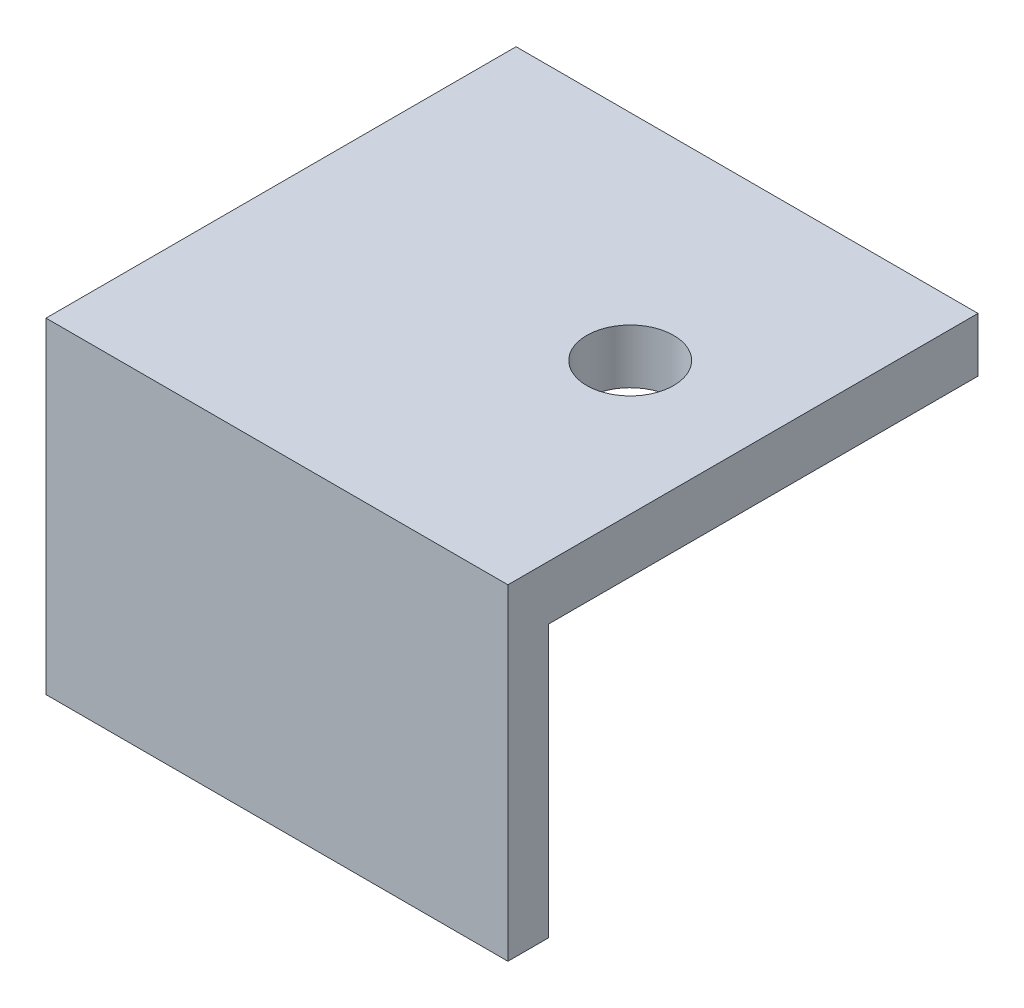
ISO-10303-21;
HEADER;
FILE_DESCRIPTION(('STEP AP214'),'2;1');
FILE_NAME('part.step','',(''),(''),'','','');
FILE_SCHEMA(('AUTOMOTIVE_DESIGN { 1 0 10303 214 1 1 1 1 }'));
ENDSEC;
DATA;
#1=APPLICATION_CONTEXT('core data for automotive mechanical design processes');
#2=APPLICATION_PROTOCOL_DEFINITION('international standard','automotive_design',2000,#1);
#3=PRODUCT_CONTEXT('',#1,'mechanical');
#4=PRODUCT('Part','Part','',(#3));
#5=PRODUCT_RELATED_PRODUCT_CATEGORY('part','',(#4));
#6=PRODUCT_DEFINITION_FORMATION('','',#4);
#7=PRODUCT_DEFINITION_CONTEXT('part definition',#1,'design');
#8=PRODUCT_DEFINITION('design','',#6,#7);
#9=PRODUCT_DEFINITION_SHAPE('','',#8);
#10=(LENGTH_UNIT() NAMED_UNIT(*) SI_UNIT(.MILLI.,.METRE.));
#11=(NAMED_UNIT(*) PLANE_ANGLE_UNIT() SI_UNIT($,.RADIAN.));
#12=(NAMED_UNIT(*) SI_UNIT($,.STERADIAN.) SOLID_ANGLE_UNIT());
#13=UNCERTAINTY_MEASURE_WITH_UNIT(LENGTH_MEASURE(1.E-05),#10,'distance_accuracy_value','');
#14=(GEOMETRIC_REPRESENTATION_CONTEXT(3) GLOBAL_UNCERTAINTY_ASSIGNED_CONTEXT((#13)) GLOBAL_UNIT_ASSIGNED_CONTEXT((#10,
#11,#12)) REPRESENTATION_CONTEXT('',''));
#15=CARTESIAN_POINT('',(0.,0.,0.));
#16=DIRECTION('',(0.,0.,1.));
#17=DIRECTION('',(1.,0.,0.));
#18=AXIS2_PLACEMENT_3D('',#15,#16,#17);
#19=CARTESIAN_POINT('',(0.,10.,0.));
#20=DIRECTION('',(1.,0.,0.));
#21=DIRECTION('',(0.,0.,-1.));
#22=AXIS2_PLACEMENT_3D('',#19,#20,#21);
#23=PLANE('',#22);
#24=DIRECTION('',(0.,0.,1.));
#25=VECTOR('',#24,1.);
#26=CARTESIAN_POINT('',(0.,12.,0.));
#27=LINE('',#26,#25);
#28=CARTESIAN_POINT('',(0.,12.,-17.3));
#29=VERTEX_POINT('',#28);
#30=CARTESIAN_POINT('',(0.,12.,0.));
#31=VERTEX_POINT('',#30);
#32=EDGE_CURVE('E123',#29,#31,#27,.T.);
#33=ORIENTED_EDGE('',*,*,#32,.F.);
#34=DIRECTION('',(0.,-1.,0.));
#35=VECTOR('',#34,1.);
#36=CARTESIAN_POINT('',(0.,12.,-17.3));
#37=LINE('',#36,#35);
#38=CARTESIAN_POINT('',(0.,0.,-17.3));
#39=VERTEX_POINT('',#38);
#40=EDGE_CURVE('E133',#29,#39,#37,.T.);
#41=ORIENTED_EDGE('',*,*,#40,.T.);
#42=DIRECTION('',(0.,0.,1.));
#43=VECTOR('',#42,1.);
#44=CARTESIAN_POINT('',(0.,0.,0.));
#45=LINE('',#44,#43);
#46=CARTESIAN_POINT('',(0.,0.,0.));
#47=VERTEX_POINT('',#46);
#48=EDGE_CURVE('E114',#39,#47,#45,.T.);
#49=ORIENTED_EDGE('',*,*,#48,.T.);
#50=DIRECTION('',(0.,-1.,0.));
#51=VECTOR('',#50,1.);
#52=CARTESIAN_POINT('',(0.,10.,0.));
#53=LINE('',#52,#51);
#54=EDGE_CURVE('E11',#31,#47,#53,.T.);
#55=ORIENTED_EDGE('',*,*,#54,.F.);
#56=EDGE_LOOP('',(#33,#41,#49,#55));
#57=FACE_BOUND('',#56,.T.);
#58=ADVANCED_FACE('F35',(#57),#23,.F.);
#59=CARTESIAN_POINT('',(0.,10.,0.));
#60=DIRECTION('',(0.,0.,-1.));
#61=DIRECTION('',(-1.,0.,0.));
#62=AXIS2_PLACEMENT_3D('',#59,#60,#61);
#63=PLANE('',#62);
#64=DIRECTION('',(1.,0.,0.));
#65=VECTOR('',#64,1.);
#66=CARTESIAN_POINT('',(0.,0.,0.));
#67=LINE('',#66,#65);
#68=CARTESIAN_POINT('',(17.,0.,0.));
#69=VERTEX_POINT('',#68);
#70=EDGE_CURVE('E113',#47,#69,#67,.T.);
#71=ORIENTED_EDGE('',*,*,#70,.T.);
#72=DIRECTION('',(0.,-1.,0.));
#73=VECTOR('',#72,1.);
#74=CARTESIAN_POINT('',(17.,10.,0.));
#75=LINE('',#74,#73);
#76=CARTESIAN_POINT('',(17.,12.,0.));
#77=VERTEX_POINT('',#76);
#78=EDGE_CURVE('E43',#77,#69,#75,.T.);
#79=ORIENTED_EDGE('',*,*,#78,.F.);
#80=DIRECTION('',(1.,0.,0.));
#81=VECTOR('',#80,1.);
#82=CARTESIAN_POINT('',(0.,12.,0.));
#83=LINE('',#82,#81);
#84=EDGE_CURVE('E126',#31,#77,#83,.T.);
#85=ORIENTED_EDGE('',*,*,#84,.F.);
#86=ORIENTED_EDGE('',*,*,#54,.T.);
#87=EDGE_LOOP('',(#71,#79,#85,#86));
#88=FACE_BOUND('',#87,.T.);
#89=ADVANCED_FACE('F160',(#88),#63,.F.);
#90=CARTESIAN_POINT('',(1.5,10.,-1.5));
#91=DIRECTION('',(0.,0.,1.));
#92=DIRECTION('',(1.,0.,0.));
#93=AXIS2_PLACEMENT_3D('',#90,#91,#92);
#94=PLANE('',#93);
#95=DIRECTION('',(-1.,0.,0.));
#96=VECTOR('',#95,1.);
#97=CARTESIAN_POINT('',(1.5,0.,-1.5));
#98=LINE('',#97,#96);
#99=CARTESIAN_POINT('',(17.,0.,-1.5));
#100=VERTEX_POINT('',#99);
#101=CARTESIAN_POINT('',(1.5,0.,-1.5));
#102=VERTEX_POINT('',#101);
#103=EDGE_CURVE('E68',#100,#102,#98,.T.);
#104=ORIENTED_EDGE('',*,*,#103,.T.);
#105=DIRECTION('',(0.,-1.,0.));
#106=VECTOR('',#105,1.);
#107=CARTESIAN_POINT('',(1.5,10.,-1.5));
#108=LINE('',#107,#106);
#109=CARTESIAN_POINT('',(1.5,10.,-1.5));
#110=VERTEX_POINT('',#109);
#111=EDGE_CURVE('E51',#110,#102,#108,.T.);
#112=ORIENTED_EDGE('',*,*,#111,.F.);
#113=DIRECTION('',(-1.,0.,0.));
#114=VECTOR('',#113,1.);
#115=CARTESIAN_POINT('',(15.5,10.,-1.5));
#116=LINE('',#115,#114);
#117=CARTESIAN_POINT('',(17.,10.,-1.5));
#118=VERTEX_POINT('',#117);
#119=EDGE_CURVE('E91',#118,#110,#116,.T.);
#120=ORIENTED_EDGE('',*,*,#119,.F.);
#121=DIRECTION('',(0.,-1.,0.));
#122=VECTOR('',#121,1.);
#123=CARTESIAN_POINT('',(17.,10.,-1.5));
#124=LINE('',#123,#122);
#125=EDGE_CURVE('E72',#118,#100,#124,.T.);
#126=ORIENTED_EDGE('',*,*,#125,.T.);
#127=EDGE_LOOP('',(#104,#112,#120,#126));
#128=FACE_BOUND('',#127,.T.);
#129=ADVANCED_FACE('F71',(#128),#94,.F.);
#130=CARTESIAN_POINT('',(1.5,10.,-1.5));
#131=DIRECTION('',(-1.,0.,0.));
#132=DIRECTION('',(0.,0.,1.));
#133=AXIS2_PLACEMENT_3D('',#130,#131,#132);
#134=PLANE('',#133);
#135=DIRECTION('',(0.,0.,-1.));
#136=VECTOR('',#135,1.);
#137=CARTESIAN_POINT('',(1.5,0.,-1.5));
#138=LINE('',#137,#136);
#139=CARTESIAN_POINT('',(1.5,0.,-17.3));
#140=VERTEX_POINT('',#139);
#141=EDGE_CURVE('E73',#102,#140,#138,.T.);
#142=ORIENTED_EDGE('',*,*,#141,.T.);
#143=DIRECTION('',(0.,-1.,0.));
#144=VECTOR('',#143,1.);
#145=CARTESIAN_POINT('',(1.5,10.,-17.3));
#146=LINE('',#145,#144);
#147=CARTESIAN_POINT('',(1.5,10.,-17.3));
#148=VERTEX_POINT('',#147);
#149=EDGE_CURVE('E84',#148,#140,#146,.T.);
#150=ORIENTED_EDGE('',*,*,#149,.F.);
#151=DIRECTION('',(0.,0.,-1.));
#152=VECTOR('',#151,1.);
#153=CARTESIAN_POINT('',(1.5,10.,-1.5));
#154=LINE('',#153,#152);
#155=EDGE_CURVE('E82',#110,#148,#154,.T.);
#156=ORIENTED_EDGE('',*,*,#155,.F.);
#157=ORIENTED_EDGE('',*,*,#111,.T.);
#158=EDGE_LOOP('',(#142,#150,#156,#157));
#159=FACE_BOUND('',#158,.T.);
#160=ADVANCED_FACE('F78',(#159),#134,.F.);
#161=CARTESIAN_POINT('',(17.,10.,-17.3));
#162=DIRECTION('',(-1.,0.,0.));
#163=DIRECTION('',(0.,0.,1.));
#164=AXIS2_PLACEMENT_3D('',#161,#162,#163);
#165=PLANE('',#164);
#166=DIRECTION('',(0.,0.,-1.));
#167=VECTOR('',#166,1.);
#168=CARTESIAN_POINT('',(17.,10.,0.));
#169=LINE('',#168,#167);
#170=CARTESIAN_POINT('',(17.,10.,-17.3));
#171=VERTEX_POINT('',#170);
#172=EDGE_CURVE('E121',#118,#171,#169,.T.);
#173=ORIENTED_EDGE('',*,*,#172,.T.);
#174=DIRECTION('',(0.,-1.,0.));
#175=VECTOR('',#174,1.);
#176=CARTESIAN_POINT('',(17.,12.,-17.3));
#177=LINE('',#176,#175);
#178=CARTESIAN_POINT('',(17.,12.,-17.3));
#179=VERTEX_POINT('',#178);
#180=EDGE_CURVE('E136',#179,#171,#177,.T.);
#181=ORIENTED_EDGE('',*,*,#180,.F.);
#182=DIRECTION('',(0.,0.,-1.));
#183=VECTOR('',#182,1.);
#184=CARTESIAN_POINT('',(17.,12.,0.));
#185=LINE('',#184,#183);
#186=EDGE_CURVE('E108',#77,#179,#185,.T.);
#187=ORIENTED_EDGE('',*,*,#186,.F.);
#188=ORIENTED_EDGE('',*,*,#78,.T.);
#189=DIRECTION('',(0.,0.,-1.));
#190=VECTOR('',#189,1.);
#191=CARTESIAN_POINT('',(17.,0.,0.));
#192=LINE('',#191,#190);
#193=EDGE_CURVE('E74',#69,#100,#192,.T.);
#194=ORIENTED_EDGE('',*,*,#193,.T.);
#195=ORIENTED_EDGE('',*,*,#125,.F.);
#196=EDGE_LOOP('',(#173,#181,#187,#188,#194,#195));
#197=FACE_BOUND('',#196,.T.);
#198=ADVANCED_FACE('F104',(#197),#165,.F.);
#199=CARTESIAN_POINT('',(0.,0.,0.));
#200=DIRECTION('',(0.,-1.,0.));
#201=DIRECTION('',(0.,0.,-1.));
#202=AXIS2_PLACEMENT_3D('',#199,#200,#201);
#203=PLANE('',#202);
#204=DIRECTION('',(-1.,0.,0.));
#205=VECTOR('',#204,1.);
#206=CARTESIAN_POINT('',(17.,0.,-17.3));
#207=LINE('',#206,#205);
#208=EDGE_CURVE('E90',#140,#39,#207,.T.);
#209=ORIENTED_EDGE('',*,*,#208,.F.);
#210=ORIENTED_EDGE('',*,*,#141,.F.);
#211=ORIENTED_EDGE('',*,*,#103,.F.);
#212=ORIENTED_EDGE('',*,*,#193,.F.);
#213=ORIENTED_EDGE('',*,*,#70,.F.);
#214=ORIENTED_EDGE('',*,*,#48,.F.);
#215=EDGE_LOOP('',(#209,#210,#211,#212,#213,#214));
#216=FACE_BOUND('',#215,.T.);
#217=ADVANCED_FACE('F87',(#216),#203,.T.);
#218=CARTESIAN_POINT('',(0.,12.,0.));
#219=DIRECTION('',(0.,-1.,0.));
#220=DIRECTION('',(0.,0.,-1.));
#221=AXIS2_PLACEMENT_3D('',#218,#219,#220);
#222=PLANE('',#221);
#223=ORIENTED_EDGE('',*,*,#186,.T.);
#224=DIRECTION('',(-1.,0.,0.));
#225=VECTOR('',#224,1.);
#226=CARTESIAN_POINT('',(17.,12.,-17.3));
#227=LINE('',#226,#225);
#228=EDGE_CURVE('E139',#179,#29,#227,.T.);
#229=ORIENTED_EDGE('',*,*,#228,.T.);
#230=ORIENTED_EDGE('',*,*,#32,.T.);
#231=ORIENTED_EDGE('',*,*,#84,.T.);
#232=EDGE_LOOP('',(#223,#229,#230,#231));
#233=FACE_BOUND('',#232,.T.);
#234=CARTESIAN_POINT('',(12.1,12.,-9.4));
#235=DIRECTION('',(0.,1.,0.));
#236=DIRECTION('',(0.,0.,1.));
#237=AXIS2_PLACEMENT_3D('',#234,#235,#236);
#238=CIRCLE('',#237,1.6);
#239=CARTESIAN_POINT('',(12.1,12.,-7.8));
#240=VERTEX_POINT('',#239);
#241=EDGE_CURVE('E124',#240,#240,#238,.T.);
#242=ORIENTED_EDGE('',*,*,#241,.F.);
#243=EDGE_LOOP('',(#242));
#244=FACE_BOUND('',#243,.T.);
#245=ADVANCED_FACE('F148',(#233,#244),#222,.F.);
#246=CARTESIAN_POINT('',(0.,10.,0.));
#247=DIRECTION('',(0.,-1.,0.));
#248=DIRECTION('',(0.,0.,-1.));
#249=AXIS2_PLACEMENT_3D('',#246,#247,#248);
#250=PLANE('',#249);
#251=ORIENTED_EDGE('',*,*,#172,.F.);
#252=ORIENTED_EDGE('',*,*,#119,.T.);
#253=ORIENTED_EDGE('',*,*,#155,.T.);
#254=DIRECTION('',(1.,0.,0.));
#255=VECTOR('',#254,1.);
#256=CARTESIAN_POINT('',(1.5,10.,-17.3));
#257=LINE('',#256,#255);
#258=EDGE_CURVE('E97',#148,#171,#257,.T.);
#259=ORIENTED_EDGE('',*,*,#258,.T.);
#260=EDGE_LOOP('',(#251,#252,#253,#259));
#261=FACE_BOUND('',#260,.T.);
#262=CARTESIAN_POINT('',(12.1,10.,-9.4));
#263=DIRECTION('',(0.,1.,0.));
#264=DIRECTION('',(0.,0.,1.));
#265=AXIS2_PLACEMENT_3D('',#262,#263,#264);
#266=CIRCLE('',#265,1.6);
#267=CARTESIAN_POINT('',(12.1,10.,-7.8));
#268=VERTEX_POINT('',#267);
#269=EDGE_CURVE('E130',#268,#268,#266,.T.);
#270=ORIENTED_EDGE('',*,*,#269,.T.);
#271=EDGE_LOOP('',(#270));
#272=FACE_BOUND('',#271,.T.);
#273=ADVANCED_FACE('F170',(#261,#272),#250,.T.);
#274=CARTESIAN_POINT('',(12.1,12.,-9.4));
#275=DIRECTION('',(0.,-1.,0.));
#276=DIRECTION('',(0.,0.,-1.));
#277=AXIS2_PLACEMENT_3D('',#274,#275,#276);
#278=CYLINDRICAL_SURFACE('',#277,1.6);
#279=ORIENTED_EDGE('',*,*,#241,.T.);
#280=EDGE_LOOP('',(#279));
#281=FACE_BOUND('',#280,.T.);
#282=ORIENTED_EDGE('',*,*,#269,.F.);
#283=EDGE_LOOP('',(#282));
#284=FACE_BOUND('',#283,.T.);
#285=ADVANCED_FACE('F173',(#281,#284),#278,.F.);
#286=CARTESIAN_POINT('',(17.,12.,-17.3));
#287=DIRECTION('',(0.,0.,1.));
#288=DIRECTION('',(1.,0.,0.));
#289=AXIS2_PLACEMENT_3D('',#286,#287,#288);
#290=PLANE('',#289);
#291=ORIENTED_EDGE('',*,*,#208,.T.);
#292=ORIENTED_EDGE('',*,*,#40,.F.);
#293=ORIENTED_EDGE('',*,*,#228,.F.);
#294=ORIENTED_EDGE('',*,*,#180,.T.);
#295=ORIENTED_EDGE('',*,*,#258,.F.);
#296=ORIENTED_EDGE('',*,*,#149,.T.);
#297=EDGE_LOOP('',(#291,#292,#293,#294,#295,#296));
#298=FACE_BOUND('',#297,.T.);
#299=ADVANCED_FACE('F167',(#298),#290,.F.);
#300=CLOSED_SHELL('',(#58,#89,#129,#160,#198,#217,#245,#273,#285,#299));
#301=MANIFOLD_SOLID_BREP('B2',#300);
#302=ADVANCED_BREP_SHAPE_REPRESENTATION('',(#18,#301),#14);
#303=SHAPE_DEFINITION_REPRESENTATION(#9,#302);
ENDSEC;
END-ISO-10303-21;
